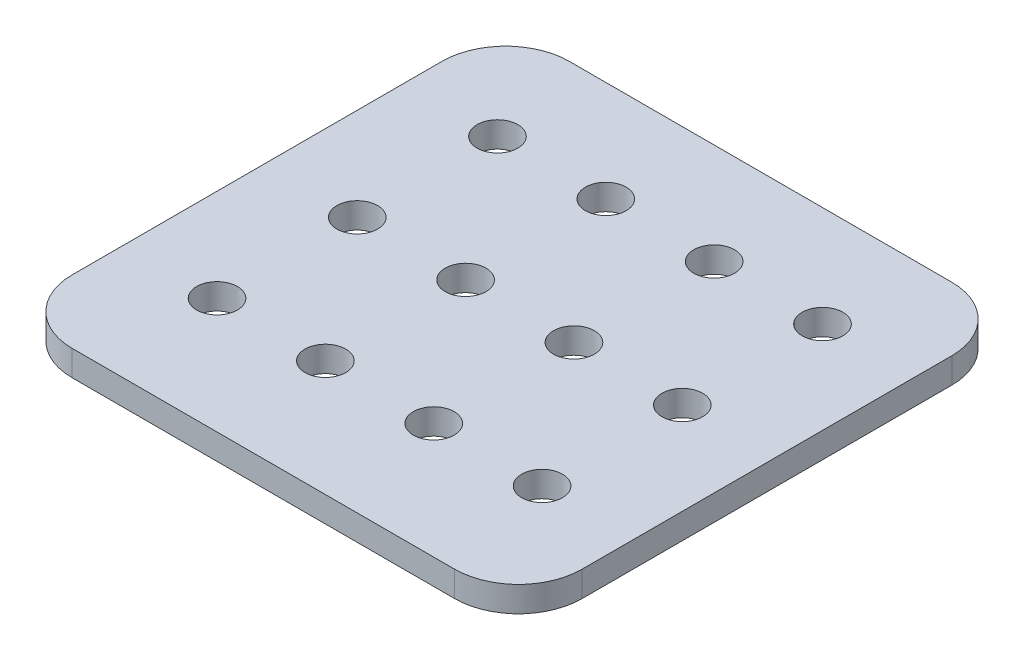
ISO-10303-21;
HEADER;
FILE_DESCRIPTION(('STEP AP214'),'2;1');
FILE_NAME('part.step','',(''),(''),'','','');
FILE_SCHEMA(('AUTOMOTIVE_DESIGN { 1 0 10303 214 1 1 1 1 }'));
ENDSEC;
DATA;
#1=APPLICATION_CONTEXT('core data for automotive mechanical design processes');
#2=APPLICATION_PROTOCOL_DEFINITION('international standard','automotive_design',2000,#1);
#3=PRODUCT_CONTEXT('',#1,'mechanical');
#4=PRODUCT('Part','Part','',(#3));
#5=PRODUCT_RELATED_PRODUCT_CATEGORY('part','',(#4));
#6=PRODUCT_DEFINITION_FORMATION('','',#4);
#7=PRODUCT_DEFINITION_CONTEXT('part definition',#1,'design');
#8=PRODUCT_DEFINITION('design','',#6,#7);
#9=PRODUCT_DEFINITION_SHAPE('','',#8);
#10=(LENGTH_UNIT() NAMED_UNIT(*) SI_UNIT(.MILLI.,.METRE.));
#11=(NAMED_UNIT(*) PLANE_ANGLE_UNIT() SI_UNIT($,.RADIAN.));
#12=(NAMED_UNIT(*) SI_UNIT($,.STERADIAN.) SOLID_ANGLE_UNIT());
#13=UNCERTAINTY_MEASURE_WITH_UNIT(LENGTH_MEASURE(1.E-05),#10,'distance_accuracy_value','');
#14=(GEOMETRIC_REPRESENTATION_CONTEXT(3) GLOBAL_UNCERTAINTY_ASSIGNED_CONTEXT((#13)) GLOBAL_UNIT_ASSIGNED_CONTEXT((#10,
#11,#12)) REPRESENTATION_CONTEXT('',''));
#15=CARTESIAN_POINT('',(0.,0.,0.));
#16=DIRECTION('',(0.,0.,1.));
#17=DIRECTION('',(1.,0.,0.));
#18=AXIS2_PLACEMENT_3D('',#15,#16,#17);
#19=CARTESIAN_POINT('',(0.,2.,0.));
#20=DIRECTION('',(0.,-1.,0.));
#21=DIRECTION('',(0.,0.,-1.));
#22=AXIS2_PLACEMENT_3D('',#19,#20,#21);
#23=PLANE('',#22);
#24=DIRECTION('',(0.,0.,-1.));
#25=VECTOR('',#24,1.);
#26=CARTESIAN_POINT('',(-7.22031787389912,2.,-25.1598945072976));
#27=LINE('',#26,#25);
#28=CARTESIAN_POINT('',(-7.22031787389912,2.,8.84010549270235));
#29=VERTEX_POINT('',#28);
#30=CARTESIAN_POINT('',(-7.22031787389912,2.,-20.1598945072976));
#31=VERTEX_POINT('',#30);
#32=EDGE_CURVE('E206',#29,#31,#27,.T.);
#33=ORIENTED_EDGE('',*,*,#32,.T.);
#34=CARTESIAN_POINT('',(-12.2203178738991,2.,-20.1598945072976));
#35=DIRECTION('',(0.,-1.,0.));
#36=DIRECTION('',(0.,0.,-1.));
#37=AXIS2_PLACEMENT_3D('',#34,#35,#36);
#38=CIRCLE('',#37,5.);
#39=CARTESIAN_POINT('',(-12.2203178738991,2.,-25.1598945072976));
#40=VERTEX_POINT('',#39);
#41=EDGE_CURVE('E176',#31,#40,#38,.F.);
#42=ORIENTED_EDGE('',*,*,#41,.T.);
#43=DIRECTION('',(-1.,0.,0.));
#44=VECTOR('',#43,1.);
#45=CARTESIAN_POINT('',(-47.2203178738991,2.,-25.1598945072976));
#46=LINE('',#45,#44);
#47=CARTESIAN_POINT('',(-42.2203178738991,2.,-25.1598945072976));
#48=VERTEX_POINT('',#47);
#49=EDGE_CURVE('E134',#40,#48,#46,.T.);
#50=ORIENTED_EDGE('',*,*,#49,.T.);
#51=CARTESIAN_POINT('',(-42.2203178738991,2.,-20.1598945072976));
#52=DIRECTION('',(0.,-1.,0.));
#53=DIRECTION('',(0.,0.,-1.));
#54=AXIS2_PLACEMENT_3D('',#51,#52,#53);
#55=CIRCLE('',#54,5.);
#56=CARTESIAN_POINT('',(-47.2203178738991,2.,-20.1598945072976));
#57=VERTEX_POINT('',#56);
#58=EDGE_CURVE('E170',#48,#57,#55,.F.);
#59=ORIENTED_EDGE('',*,*,#58,.T.);
#60=DIRECTION('',(0.,0.,1.));
#61=VECTOR('',#60,1.);
#62=CARTESIAN_POINT('',(-47.2203178738991,2.,13.8401054927024));
#63=LINE('',#62,#61);
#64=CARTESIAN_POINT('',(-47.2203178738991,2.,8.84010549270236));
#65=VERTEX_POINT('',#64);
#66=EDGE_CURVE('E144',#57,#65,#63,.T.);
#67=ORIENTED_EDGE('',*,*,#66,.T.);
#68=CARTESIAN_POINT('',(-42.2203178738991,2.,8.84010549270236));
#69=DIRECTION('',(0.,-1.,0.));
#70=DIRECTION('',(0.,0.,-1.));
#71=AXIS2_PLACEMENT_3D('',#68,#69,#70);
#72=CIRCLE('',#71,5.);
#73=CARTESIAN_POINT('',(-42.2203178738991,2.,13.8401054927024));
#74=VERTEX_POINT('',#73);
#75=EDGE_CURVE('E68',#65,#74,#72,.F.);
#76=ORIENTED_EDGE('',*,*,#75,.T.);
#77=DIRECTION('',(1.,0.,0.));
#78=VECTOR('',#77,1.);
#79=CARTESIAN_POINT('',(-7.22031787389912,2.,13.8401054927024));
#80=LINE('',#79,#78);
#81=CARTESIAN_POINT('',(-12.2203178738991,2.,13.8401054927024));
#82=VERTEX_POINT('',#81);
#83=EDGE_CURVE('E149',#74,#82,#80,.T.);
#84=ORIENTED_EDGE('',*,*,#83,.T.);
#85=CARTESIAN_POINT('',(-12.2203178738991,2.,8.84010549270235));
#86=DIRECTION('',(0.,-1.,0.));
#87=DIRECTION('',(0.,0.,-1.));
#88=AXIS2_PLACEMENT_3D('',#85,#86,#87);
#89=CIRCLE('',#88,5.);
#90=EDGE_CURVE('E173',#82,#29,#89,.F.);
#91=ORIENTED_EDGE('',*,*,#90,.T.);
#92=EDGE_LOOP('',(#33,#42,#50,#59,#67,#76,#84,#91));
#93=FACE_BOUND('',#92,.T.);
#94=CARTESIAN_POINT('',(-14.445697189582,2.,-17.2452207331818));
#95=DIRECTION('',(0.,1.,0.));
#96=DIRECTION('',(0.,0.,1.));
#97=AXIS2_PLACEMENT_3D('',#94,#95,#96);
#98=CIRCLE('',#97,1.6);
#99=CARTESIAN_POINT('',(-14.445697189582,2.,-15.6452207331818));
#100=VERTEX_POINT('',#99);
#101=EDGE_CURVE('E201',#100,#100,#98,.T.);
#102=ORIENTED_EDGE('',*,*,#101,.F.);
#103=EDGE_LOOP('',(#102));
#104=FACE_BOUND('',#103,.T.);
#105=CARTESIAN_POINT('',(-14.445697189582,2.,-6.24522073318179));
#106=DIRECTION('',(0.,1.,0.));
#107=DIRECTION('',(0.,0.,1.));
#108=AXIS2_PLACEMENT_3D('',#105,#106,#107);
#109=CIRCLE('',#108,1.6);
#110=CARTESIAN_POINT('',(-14.445697189582,2.,-4.64522073318179));
#111=VERTEX_POINT('',#110);
#112=EDGE_CURVE('E215',#111,#111,#109,.T.);
#113=ORIENTED_EDGE('',*,*,#112,.F.);
#114=EDGE_LOOP('',(#113));
#115=FACE_BOUND('',#114,.T.);
#116=CARTESIAN_POINT('',(-14.445697189582,2.,4.75477926681821));
#117=DIRECTION('',(0.,1.,0.));
#118=DIRECTION('',(0.,0.,1.));
#119=AXIS2_PLACEMENT_3D('',#116,#117,#118);
#120=CIRCLE('',#119,1.6);
#121=CARTESIAN_POINT('',(-14.445697189582,2.,6.35477926681821));
#122=VERTEX_POINT('',#121);
#123=EDGE_CURVE('E223',#122,#122,#120,.T.);
#124=ORIENTED_EDGE('',*,*,#123,.F.);
#125=EDGE_LOOP('',(#124));
#126=FACE_BOUND('',#125,.T.);
#127=CARTESIAN_POINT('',(-22.945697189582,2.,-17.2452207331818));
#128=DIRECTION('',(0.,1.,0.));
#129=DIRECTION('',(0.,0.,1.));
#130=AXIS2_PLACEMENT_3D('',#127,#128,#129);
#131=CIRCLE('',#130,1.6);
#132=CARTESIAN_POINT('',(-22.945697189582,2.,-15.6452207331818));
#133=VERTEX_POINT('',#132);
#134=EDGE_CURVE('E231',#133,#133,#131,.T.);
#135=ORIENTED_EDGE('',*,*,#134,.F.);
#136=EDGE_LOOP('',(#135));
#137=FACE_BOUND('',#136,.T.);
#138=CARTESIAN_POINT('',(-22.945697189582,2.,-6.24522073318179));
#139=DIRECTION('',(0.,1.,0.));
#140=DIRECTION('',(0.,0.,1.));
#141=AXIS2_PLACEMENT_3D('',#138,#139,#140);
#142=CIRCLE('',#141,1.6);
#143=CARTESIAN_POINT('',(-22.945697189582,2.,-4.64522073318179));
#144=VERTEX_POINT('',#143);
#145=EDGE_CURVE('E239',#144,#144,#142,.T.);
#146=ORIENTED_EDGE('',*,*,#145,.F.);
#147=EDGE_LOOP('',(#146));
#148=FACE_BOUND('',#147,.T.);
#149=CARTESIAN_POINT('',(-22.945697189582,2.,4.75477926681821));
#150=DIRECTION('',(0.,1.,0.));
#151=DIRECTION('',(0.,0.,1.));
#152=AXIS2_PLACEMENT_3D('',#149,#150,#151);
#153=CIRCLE('',#152,1.6);
#154=CARTESIAN_POINT('',(-22.945697189582,2.,6.35477926681821));
#155=VERTEX_POINT('',#154);
#156=EDGE_CURVE('E247',#155,#155,#153,.T.);
#157=ORIENTED_EDGE('',*,*,#156,.F.);
#158=EDGE_LOOP('',(#157));
#159=FACE_BOUND('',#158,.T.);
#160=CARTESIAN_POINT('',(-31.445697189582,2.,-17.2452207331818));
#161=DIRECTION('',(0.,1.,0.));
#162=DIRECTION('',(0.,0.,1.));
#163=AXIS2_PLACEMENT_3D('',#160,#161,#162);
#164=CIRCLE('',#163,1.6);
#165=CARTESIAN_POINT('',(-31.445697189582,2.,-15.6452207331818));
#166=VERTEX_POINT('',#165);
#167=EDGE_CURVE('E255',#166,#166,#164,.T.);
#168=ORIENTED_EDGE('',*,*,#167,.F.);
#169=EDGE_LOOP('',(#168));
#170=FACE_BOUND('',#169,.T.);
#171=CARTESIAN_POINT('',(-31.445697189582,2.,-6.24522073318179));
#172=DIRECTION('',(0.,1.,0.));
#173=DIRECTION('',(0.,0.,1.));
#174=AXIS2_PLACEMENT_3D('',#171,#172,#173);
#175=CIRCLE('',#174,1.6);
#176=CARTESIAN_POINT('',(-31.445697189582,2.,-4.64522073318179));
#177=VERTEX_POINT('',#176);
#178=EDGE_CURVE('E263',#177,#177,#175,.T.);
#179=ORIENTED_EDGE('',*,*,#178,.F.);
#180=EDGE_LOOP('',(#179));
#181=FACE_BOUND('',#180,.T.);
#182=CARTESIAN_POINT('',(-31.445697189582,2.,4.75477926681821));
#183=DIRECTION('',(0.,1.,0.));
#184=DIRECTION('',(0.,0.,1.));
#185=AXIS2_PLACEMENT_3D('',#182,#183,#184);
#186=CIRCLE('',#185,1.6);
#187=CARTESIAN_POINT('',(-31.445697189582,2.,6.35477926681821));
#188=VERTEX_POINT('',#187);
#189=EDGE_CURVE('E271',#188,#188,#186,.T.);
#190=ORIENTED_EDGE('',*,*,#189,.F.);
#191=EDGE_LOOP('',(#190));
#192=FACE_BOUND('',#191,.T.);
#193=CARTESIAN_POINT('',(-39.945697189582,2.,-17.2452207331818));
#194=DIRECTION('',(0.,1.,0.));
#195=DIRECTION('',(0.,0.,1.));
#196=AXIS2_PLACEMENT_3D('',#193,#194,#195);
#197=CIRCLE('',#196,1.6);
#198=CARTESIAN_POINT('',(-39.945697189582,2.,-15.6452207331818));
#199=VERTEX_POINT('',#198);
#200=EDGE_CURVE('E279',#199,#199,#197,.T.);
#201=ORIENTED_EDGE('',*,*,#200,.F.);
#202=EDGE_LOOP('',(#201));
#203=FACE_BOUND('',#202,.T.);
#204=CARTESIAN_POINT('',(-39.945697189582,2.,-6.24522073318179));
#205=DIRECTION('',(0.,1.,0.));
#206=DIRECTION('',(0.,0.,1.));
#207=AXIS2_PLACEMENT_3D('',#204,#205,#206);
#208=CIRCLE('',#207,1.60000000000001);
#209=CARTESIAN_POINT('',(-39.945697189582,2.,-4.64522073318179));
#210=VERTEX_POINT('',#209);
#211=EDGE_CURVE('E287',#210,#210,#208,.T.);
#212=ORIENTED_EDGE('',*,*,#211,.F.);
#213=EDGE_LOOP('',(#212));
#214=FACE_BOUND('',#213,.T.);
#215=CARTESIAN_POINT('',(-39.945697189582,2.,4.75477926681821));
#216=DIRECTION('',(0.,1.,0.));
#217=DIRECTION('',(0.,0.,1.));
#218=AXIS2_PLACEMENT_3D('',#215,#216,#217);
#219=CIRCLE('',#218,1.60000000000001);
#220=CARTESIAN_POINT('',(-39.945697189582,2.,6.35477926681821));
#221=VERTEX_POINT('',#220);
#222=EDGE_CURVE('E295',#221,#221,#219,.T.);
#223=ORIENTED_EDGE('',*,*,#222,.F.);
#224=EDGE_LOOP('',(#223));
#225=FACE_BOUND('',#224,.T.);
#226=ADVANCED_FACE('F45',(#93,#104,#115,#126,#137,#148,#159,#170,#181,#192,#203,#214,#225),#23,.F.);
#227=CARTESIAN_POINT('',(0.,0.,0.));
#228=DIRECTION('',(0.,-1.,0.));
#229=DIRECTION('',(0.,0.,-1.));
#230=AXIS2_PLACEMENT_3D('',#227,#228,#229);
#231=PLANE('',#230);
#232=CARTESIAN_POINT('',(-39.945697189582,0.,-6.24522073318179));
#233=DIRECTION('',(0.,1.,0.));
#234=DIRECTION('',(0.,0.,1.));
#235=AXIS2_PLACEMENT_3D('',#232,#233,#234);
#236=CIRCLE('',#235,1.60000000000001);
#237=CARTESIAN_POINT('',(-39.945697189582,0.,-4.64522073318179));
#238=VERTEX_POINT('',#237);
#239=EDGE_CURVE('E291',#238,#238,#236,.T.);
#240=ORIENTED_EDGE('',*,*,#239,.T.);
#241=EDGE_LOOP('',(#240));
#242=FACE_BOUND('',#241,.T.);
#243=CARTESIAN_POINT('',(-31.445697189582,0.,4.75477926681821));
#244=DIRECTION('',(0.,1.,0.));
#245=DIRECTION('',(0.,0.,1.));
#246=AXIS2_PLACEMENT_3D('',#243,#244,#245);
#247=CIRCLE('',#246,1.6);
#248=CARTESIAN_POINT('',(-31.445697189582,0.,6.35477926681821));
#249=VERTEX_POINT('',#248);
#250=EDGE_CURVE('E275',#249,#249,#247,.T.);
#251=ORIENTED_EDGE('',*,*,#250,.T.);
#252=EDGE_LOOP('',(#251));
#253=FACE_BOUND('',#252,.T.);
#254=CARTESIAN_POINT('',(-31.445697189582,0.,-17.2452207331818));
#255=DIRECTION('',(0.,1.,0.));
#256=DIRECTION('',(0.,0.,1.));
#257=AXIS2_PLACEMENT_3D('',#254,#255,#256);
#258=CIRCLE('',#257,1.6);
#259=CARTESIAN_POINT('',(-31.445697189582,0.,-15.6452207331818));
#260=VERTEX_POINT('',#259);
#261=EDGE_CURVE('E259',#260,#260,#258,.T.);
#262=ORIENTED_EDGE('',*,*,#261,.T.);
#263=EDGE_LOOP('',(#262));
#264=FACE_BOUND('',#263,.T.);
#265=CARTESIAN_POINT('',(-22.945697189582,0.,-6.24522073318179));
#266=DIRECTION('',(0.,1.,0.));
#267=DIRECTION('',(0.,0.,1.));
#268=AXIS2_PLACEMENT_3D('',#265,#266,#267);
#269=CIRCLE('',#268,1.6);
#270=CARTESIAN_POINT('',(-22.945697189582,0.,-4.64522073318179));
#271=VERTEX_POINT('',#270);
#272=EDGE_CURVE('E243',#271,#271,#269,.T.);
#273=ORIENTED_EDGE('',*,*,#272,.T.);
#274=EDGE_LOOP('',(#273));
#275=FACE_BOUND('',#274,.T.);
#276=CARTESIAN_POINT('',(-14.445697189582,0.,4.75477926681821));
#277=DIRECTION('',(0.,1.,0.));
#278=DIRECTION('',(0.,0.,1.));
#279=AXIS2_PLACEMENT_3D('',#276,#277,#278);
#280=CIRCLE('',#279,1.6);
#281=CARTESIAN_POINT('',(-14.445697189582,0.,6.35477926681821));
#282=VERTEX_POINT('',#281);
#283=EDGE_CURVE('E227',#282,#282,#280,.T.);
#284=ORIENTED_EDGE('',*,*,#283,.T.);
#285=EDGE_LOOP('',(#284));
#286=FACE_BOUND('',#285,.T.);
#287=CARTESIAN_POINT('',(-14.445697189582,0.,-17.2452207331818));
#288=DIRECTION('',(0.,1.,0.));
#289=DIRECTION('',(0.,0.,1.));
#290=AXIS2_PLACEMENT_3D('',#287,#288,#289);
#291=CIRCLE('',#290,1.6);
#292=CARTESIAN_POINT('',(-14.445697189582,0.,-15.6452207331818));
#293=VERTEX_POINT('',#292);
#294=EDGE_CURVE('E211',#293,#293,#291,.T.);
#295=ORIENTED_EDGE('',*,*,#294,.T.);
#296=EDGE_LOOP('',(#295));
#297=FACE_BOUND('',#296,.T.);
#298=DIRECTION('',(-1.,0.,0.));
#299=VECTOR('',#298,1.);
#300=CARTESIAN_POINT('',(-47.2203178738991,0.,-25.1598945072976));
#301=LINE('',#300,#299);
#302=CARTESIAN_POINT('',(-12.2203178738991,0.,-25.1598945072976));
#303=VERTEX_POINT('',#302);
#304=CARTESIAN_POINT('',(-42.2203178738991,0.,-25.1598945072976));
#305=VERTEX_POINT('',#304);
#306=EDGE_CURVE('E131',#303,#305,#301,.T.);
#307=ORIENTED_EDGE('',*,*,#306,.F.);
#308=CARTESIAN_POINT('',(-12.2203178738991,0.,-20.1598945072976));
#309=DIRECTION('',(0.,-1.,0.));
#310=DIRECTION('',(0.,0.,-1.));
#311=AXIS2_PLACEMENT_3D('',#308,#309,#310);
#312=CIRCLE('',#311,5.);
#313=CARTESIAN_POINT('',(-7.22031787389912,0.,-20.1598945072976));
#314=VERTEX_POINT('',#313);
#315=EDGE_CURVE('E113',#303,#314,#312,.T.);
#316=ORIENTED_EDGE('',*,*,#315,.T.);
#317=DIRECTION('',(0.,0.,-1.));
#318=VECTOR('',#317,1.);
#319=CARTESIAN_POINT('',(-7.22031787389912,0.,-25.1598945072976));
#320=LINE('',#319,#318);
#321=CARTESIAN_POINT('',(-7.22031787389912,0.,8.84010549270235));
#322=VERTEX_POINT('',#321);
#323=EDGE_CURVE('E145',#322,#314,#320,.T.);
#324=ORIENTED_EDGE('',*,*,#323,.F.);
#325=CARTESIAN_POINT('',(-12.2203178738991,0.,8.84010549270235));
#326=DIRECTION('',(0.,-1.,0.));
#327=DIRECTION('',(0.,0.,-1.));
#328=AXIS2_PLACEMENT_3D('',#325,#326,#327);
#329=CIRCLE('',#328,5.);
#330=CARTESIAN_POINT('',(-12.2203178738991,0.,13.8401054927024));
#331=VERTEX_POINT('',#330);
#332=EDGE_CURVE('E125',#322,#331,#329,.T.);
#333=ORIENTED_EDGE('',*,*,#332,.T.);
#334=DIRECTION('',(1.,0.,0.));
#335=VECTOR('',#334,1.);
#336=CARTESIAN_POINT('',(-7.22031787389912,0.,13.8401054927024));
#337=LINE('',#336,#335);
#338=CARTESIAN_POINT('',(-42.2203178738991,0.,13.8401054927024));
#339=VERTEX_POINT('',#338);
#340=EDGE_CURVE('E151',#339,#331,#337,.T.);
#341=ORIENTED_EDGE('',*,*,#340,.F.);
#342=CARTESIAN_POINT('',(-42.2203178738991,0.,8.84010549270236));
#343=DIRECTION('',(0.,-1.,0.));
#344=DIRECTION('',(0.,0.,-1.));
#345=AXIS2_PLACEMENT_3D('',#342,#343,#344);
#346=CIRCLE('',#345,5.);
#347=CARTESIAN_POINT('',(-47.2203178738991,0.,8.84010549270236));
#348=VERTEX_POINT('',#347);
#349=EDGE_CURVE('E136',#339,#348,#346,.T.);
#350=ORIENTED_EDGE('',*,*,#349,.T.);
#351=DIRECTION('',(0.,0.,1.));
#352=VECTOR('',#351,1.);
#353=CARTESIAN_POINT('',(-47.2203178738991,0.,13.8401054927024));
#354=LINE('',#353,#352);
#355=CARTESIAN_POINT('',(-47.2203178738991,0.,-20.1598945072976));
#356=VERTEX_POINT('',#355);
#357=EDGE_CURVE('E191',#356,#348,#354,.T.);
#358=ORIENTED_EDGE('',*,*,#357,.F.);
#359=CARTESIAN_POINT('',(-42.2203178738991,0.,-20.1598945072976));
#360=DIRECTION('',(0.,-1.,0.));
#361=DIRECTION('',(0.,0.,-1.));
#362=AXIS2_PLACEMENT_3D('',#359,#360,#361);
#363=CIRCLE('',#362,5.);
#364=EDGE_CURVE('E142',#356,#305,#363,.T.);
#365=ORIENTED_EDGE('',*,*,#364,.T.);
#366=EDGE_LOOP('',(#307,#316,#324,#333,#341,#350,#358,#365));
#367=FACE_BOUND('',#366,.T.);
#368=CARTESIAN_POINT('',(-14.445697189582,0.,-6.24522073318179));
#369=DIRECTION('',(0.,1.,0.));
#370=DIRECTION('',(0.,0.,1.));
#371=AXIS2_PLACEMENT_3D('',#368,#369,#370);
#372=CIRCLE('',#371,1.6);
#373=CARTESIAN_POINT('',(-14.445697189582,0.,-4.64522073318179));
#374=VERTEX_POINT('',#373);
#375=EDGE_CURVE('E219',#374,#374,#372,.T.);
#376=ORIENTED_EDGE('',*,*,#375,.T.);
#377=EDGE_LOOP('',(#376));
#378=FACE_BOUND('',#377,.T.);
#379=CARTESIAN_POINT('',(-22.945697189582,0.,-17.2452207331818));
#380=DIRECTION('',(0.,1.,0.));
#381=DIRECTION('',(0.,0.,1.));
#382=AXIS2_PLACEMENT_3D('',#379,#380,#381);
#383=CIRCLE('',#382,1.6);
#384=CARTESIAN_POINT('',(-22.945697189582,0.,-15.6452207331818));
#385=VERTEX_POINT('',#384);
#386=EDGE_CURVE('E235',#385,#385,#383,.T.);
#387=ORIENTED_EDGE('',*,*,#386,.T.);
#388=EDGE_LOOP('',(#387));
#389=FACE_BOUND('',#388,.T.);
#390=CARTESIAN_POINT('',(-22.945697189582,0.,4.75477926681821));
#391=DIRECTION('',(0.,1.,0.));
#392=DIRECTION('',(0.,0.,1.));
#393=AXIS2_PLACEMENT_3D('',#390,#391,#392);
#394=CIRCLE('',#393,1.6);
#395=CARTESIAN_POINT('',(-22.945697189582,0.,6.35477926681821));
#396=VERTEX_POINT('',#395);
#397=EDGE_CURVE('E251',#396,#396,#394,.T.);
#398=ORIENTED_EDGE('',*,*,#397,.T.);
#399=EDGE_LOOP('',(#398));
#400=FACE_BOUND('',#399,.T.);
#401=CARTESIAN_POINT('',(-31.445697189582,0.,-6.24522073318179));
#402=DIRECTION('',(0.,1.,0.));
#403=DIRECTION('',(0.,0.,1.));
#404=AXIS2_PLACEMENT_3D('',#401,#402,#403);
#405=CIRCLE('',#404,1.6);
#406=CARTESIAN_POINT('',(-31.445697189582,0.,-4.64522073318179));
#407=VERTEX_POINT('',#406);
#408=EDGE_CURVE('E267',#407,#407,#405,.T.);
#409=ORIENTED_EDGE('',*,*,#408,.T.);
#410=EDGE_LOOP('',(#409));
#411=FACE_BOUND('',#410,.T.);
#412=CARTESIAN_POINT('',(-39.945697189582,0.,-17.2452207331818));
#413=DIRECTION('',(0.,1.,0.));
#414=DIRECTION('',(0.,0.,1.));
#415=AXIS2_PLACEMENT_3D('',#412,#413,#414);
#416=CIRCLE('',#415,1.6);
#417=CARTESIAN_POINT('',(-39.945697189582,0.,-15.6452207331818));
#418=VERTEX_POINT('',#417);
#419=EDGE_CURVE('E283',#418,#418,#416,.T.);
#420=ORIENTED_EDGE('',*,*,#419,.T.);
#421=EDGE_LOOP('',(#420));
#422=FACE_BOUND('',#421,.T.);
#423=CARTESIAN_POINT('',(-39.945697189582,0.,4.75477926681821));
#424=DIRECTION('',(0.,1.,0.));
#425=DIRECTION('',(0.,0.,1.));
#426=AXIS2_PLACEMENT_3D('',#423,#424,#425);
#427=CIRCLE('',#426,1.60000000000001);
#428=CARTESIAN_POINT('',(-39.945697189582,0.,6.35477926681821));
#429=VERTEX_POINT('',#428);
#430=EDGE_CURVE('E299',#429,#429,#427,.T.);
#431=ORIENTED_EDGE('',*,*,#430,.T.);
#432=EDGE_LOOP('',(#431));
#433=FACE_BOUND('',#432,.T.);
#434=ADVANCED_FACE('F139',(#242,#253,#264,#275,#286,#297,#367,#378,#389,#400,#411,#422,#433),
#231,.T.);
#435=CARTESIAN_POINT('',(-47.2203178738991,2.,13.8401054927024));
#436=DIRECTION('',(1.,0.,0.));
#437=DIRECTION('',(0.,0.,-1.));
#438=AXIS2_PLACEMENT_3D('',#435,#436,#437);
#439=PLANE('',#438);
#440=ORIENTED_EDGE('',*,*,#66,.F.);
#441=DIRECTION('',(0.,-1.,0.));
#442=VECTOR('',#441,1.);
#443=CARTESIAN_POINT('',(-47.2203178738991,2.,-20.1598945072976));
#444=LINE('',#443,#442);
#445=EDGE_CURVE('E11',#57,#356,#444,.T.);
#446=ORIENTED_EDGE('',*,*,#445,.T.);
#447=ORIENTED_EDGE('',*,*,#357,.T.);
#448=DIRECTION('',(0.,-1.,0.));
#449=VECTOR('',#448,1.);
#450=CARTESIAN_POINT('',(-47.2203178738991,2.,8.84010549270236));
#451=LINE('',#450,#449);
#452=EDGE_CURVE('E54',#348,#65,#451,.F.);
#453=ORIENTED_EDGE('',*,*,#452,.T.);
#454=EDGE_LOOP('',(#440,#446,#447,#453));
#455=FACE_BOUND('',#454,.T.);
#456=ADVANCED_FACE('F189',(#455),#439,.F.);
#457=CARTESIAN_POINT('',(-7.22031787389912,2.,13.8401054927024));
#458=DIRECTION('',(0.,0.,-1.));
#459=DIRECTION('',(-1.,0.,0.));
#460=AXIS2_PLACEMENT_3D('',#457,#458,#459);
#461=PLANE('',#460);
#462=ORIENTED_EDGE('',*,*,#340,.T.);
#463=DIRECTION('',(0.,-1.,0.));
#464=VECTOR('',#463,1.);
#465=CARTESIAN_POINT('',(-12.2203178738991,2.,13.8401054927024));
#466=LINE('',#465,#464);
#467=EDGE_CURVE('E61',#331,#82,#466,.F.);
#468=ORIENTED_EDGE('',*,*,#467,.T.);
#469=ORIENTED_EDGE('',*,*,#83,.F.);
#470=DIRECTION('',(0.,-1.,0.));
#471=VECTOR('',#470,1.);
#472=CARTESIAN_POINT('',(-42.2203178738991,2.,13.8401054927024));
#473=LINE('',#472,#471);
#474=EDGE_CURVE('E179',#74,#339,#473,.T.);
#475=ORIENTED_EDGE('',*,*,#474,.T.);
#476=EDGE_LOOP('',(#462,#468,#469,#475));
#477=FACE_BOUND('',#476,.T.);
#478=ADVANCED_FACE('F198',(#477),#461,.F.);
#479=CARTESIAN_POINT('',(-7.22031787389912,2.,-25.1598945072976));
#480=DIRECTION('',(-1.,0.,0.));
#481=DIRECTION('',(0.,0.,1.));
#482=AXIS2_PLACEMENT_3D('',#479,#480,#481);
#483=PLANE('',#482);
#484=ORIENTED_EDGE('',*,*,#323,.T.);
#485=DIRECTION('',(0.,-1.,0.));
#486=VECTOR('',#485,1.);
#487=CARTESIAN_POINT('',(-7.22031787389912,2.,-20.1598945072976));
#488=LINE('',#487,#486);
#489=EDGE_CURVE('E118',#314,#31,#488,.F.);
#490=ORIENTED_EDGE('',*,*,#489,.T.);
#491=ORIENTED_EDGE('',*,*,#32,.F.);
#492=DIRECTION('',(0.,-1.,0.));
#493=VECTOR('',#492,1.);
#494=CARTESIAN_POINT('',(-7.22031787389912,2.,8.84010549270235));
#495=LINE('',#494,#493);
#496=EDGE_CURVE('E124',#29,#322,#495,.T.);
#497=ORIENTED_EDGE('',*,*,#496,.T.);
#498=EDGE_LOOP('',(#484,#490,#491,#497));
#499=FACE_BOUND('',#498,.T.);
#500=ADVANCED_FACE('F323',(#499),#483,.F.);
#501=CARTESIAN_POINT('',(-47.2203178738991,2.,-25.1598945072976));
#502=DIRECTION('',(0.,0.,1.));
#503=DIRECTION('',(1.,0.,0.));
#504=AXIS2_PLACEMENT_3D('',#501,#502,#503);
#505=PLANE('',#504);
#506=ORIENTED_EDGE('',*,*,#49,.F.);
#507=DIRECTION('',(0.,-1.,0.));
#508=VECTOR('',#507,1.);
#509=CARTESIAN_POINT('',(-12.2203178738991,2.,-25.1598945072976));
#510=LINE('',#509,#508);
#511=EDGE_CURVE('E117',#40,#303,#510,.T.);
#512=ORIENTED_EDGE('',*,*,#511,.T.);
#513=ORIENTED_EDGE('',*,*,#306,.T.);
#514=DIRECTION('',(0.,-1.,0.));
#515=VECTOR('',#514,1.);
#516=CARTESIAN_POINT('',(-42.2203178738991,2.,-25.1598945072976));
#517=LINE('',#516,#515);
#518=EDGE_CURVE('E137',#305,#48,#517,.F.);
#519=ORIENTED_EDGE('',*,*,#518,.T.);
#520=EDGE_LOOP('',(#506,#512,#513,#519));
#521=FACE_BOUND('',#520,.T.);
#522=ADVANCED_FACE('F130',(#521),#505,.F.);
#523=CARTESIAN_POINT('',(-14.445697189582,2.,-17.2452207331818));
#524=DIRECTION('',(0.,-1.,0.));
#525=DIRECTION('',(0.,0.,-1.));
#526=AXIS2_PLACEMENT_3D('',#523,#524,#525);
#527=CYLINDRICAL_SURFACE('',#526,1.6);
#528=ORIENTED_EDGE('',*,*,#101,.T.);
#529=EDGE_LOOP('',(#528));
#530=FACE_BOUND('',#529,.T.);
#531=ORIENTED_EDGE('',*,*,#294,.F.);
#532=EDGE_LOOP('',(#531));
#533=FACE_BOUND('',#532,.T.);
#534=ADVANCED_FACE('F318',(#530,#533),#527,.F.);
#535=CARTESIAN_POINT('',(-14.445697189582,2.,-6.24522073318179));
#536=DIRECTION('',(0.,-1.,0.));
#537=DIRECTION('',(0.,0.,-1.));
#538=AXIS2_PLACEMENT_3D('',#535,#536,#537);
#539=CYLINDRICAL_SURFACE('',#538,1.6);
#540=ORIENTED_EDGE('',*,*,#112,.T.);
#541=EDGE_LOOP('',(#540));
#542=FACE_BOUND('',#541,.T.);
#543=ORIENTED_EDGE('',*,*,#375,.F.);
#544=EDGE_LOOP('',(#543));
#545=FACE_BOUND('',#544,.T.);
#546=ADVANCED_FACE('F463',(#542,#545),#539,.F.);
#547=CARTESIAN_POINT('',(-14.445697189582,2.,4.75477926681821));
#548=DIRECTION('',(0.,-1.,0.));
#549=DIRECTION('',(0.,0.,-1.));
#550=AXIS2_PLACEMENT_3D('',#547,#548,#549);
#551=CYLINDRICAL_SURFACE('',#550,1.6);
#552=ORIENTED_EDGE('',*,*,#123,.T.);
#553=EDGE_LOOP('',(#552));
#554=FACE_BOUND('',#553,.T.);
#555=ORIENTED_EDGE('',*,*,#283,.F.);
#556=EDGE_LOOP('',(#555));
#557=FACE_BOUND('',#556,.T.);
#558=ADVANCED_FACE('F453',(#554,#557),#551,.F.);
#559=CARTESIAN_POINT('',(-22.945697189582,2.,-17.2452207331818));
#560=DIRECTION('',(0.,-1.,0.));
#561=DIRECTION('',(0.,0.,-1.));
#562=AXIS2_PLACEMENT_3D('',#559,#560,#561);
#563=CYLINDRICAL_SURFACE('',#562,1.6);
#564=ORIENTED_EDGE('',*,*,#134,.T.);
#565=EDGE_LOOP('',(#564));
#566=FACE_BOUND('',#565,.T.);
#567=ORIENTED_EDGE('',*,*,#386,.F.);
#568=EDGE_LOOP('',(#567));
#569=FACE_BOUND('',#568,.T.);
#570=ADVANCED_FACE('F443',(#566,#569),#563,.F.);
#571=CARTESIAN_POINT('',(-22.945697189582,2.,-6.24522073318179));
#572=DIRECTION('',(0.,-1.,0.));
#573=DIRECTION('',(0.,0.,-1.));
#574=AXIS2_PLACEMENT_3D('',#571,#572,#573);
#575=CYLINDRICAL_SURFACE('',#574,1.6);
#576=ORIENTED_EDGE('',*,*,#145,.T.);
#577=EDGE_LOOP('',(#576));
#578=FACE_BOUND('',#577,.T.);
#579=ORIENTED_EDGE('',*,*,#272,.F.);
#580=EDGE_LOOP('',(#579));
#581=FACE_BOUND('',#580,.T.);
#582=ADVANCED_FACE('F433',(#578,#581),#575,.F.);
#583=CARTESIAN_POINT('',(-22.945697189582,2.,4.75477926681821));
#584=DIRECTION('',(0.,-1.,0.));
#585=DIRECTION('',(0.,0.,-1.));
#586=AXIS2_PLACEMENT_3D('',#583,#584,#585);
#587=CYLINDRICAL_SURFACE('',#586,1.6);
#588=ORIENTED_EDGE('',*,*,#156,.T.);
#589=EDGE_LOOP('',(#588));
#590=FACE_BOUND('',#589,.T.);
#591=ORIENTED_EDGE('',*,*,#397,.F.);
#592=EDGE_LOOP('',(#591));
#593=FACE_BOUND('',#592,.T.);
#594=ADVANCED_FACE('F423',(#590,#593),#587,.F.);
#595=CARTESIAN_POINT('',(-31.445697189582,2.,-17.2452207331818));
#596=DIRECTION('',(0.,-1.,0.));
#597=DIRECTION('',(0.,0.,-1.));
#598=AXIS2_PLACEMENT_3D('',#595,#596,#597);
#599=CYLINDRICAL_SURFACE('',#598,1.6);
#600=ORIENTED_EDGE('',*,*,#167,.T.);
#601=EDGE_LOOP('',(#600));
#602=FACE_BOUND('',#601,.T.);
#603=ORIENTED_EDGE('',*,*,#261,.F.);
#604=EDGE_LOOP('',(#603));
#605=FACE_BOUND('',#604,.T.);
#606=ADVANCED_FACE('F413',(#602,#605),#599,.F.);
#607=CARTESIAN_POINT('',(-31.445697189582,2.,-6.24522073318179));
#608=DIRECTION('',(0.,-1.,0.));
#609=DIRECTION('',(0.,0.,-1.));
#610=AXIS2_PLACEMENT_3D('',#607,#608,#609);
#611=CYLINDRICAL_SURFACE('',#610,1.6);
#612=ORIENTED_EDGE('',*,*,#178,.T.);
#613=EDGE_LOOP('',(#612));
#614=FACE_BOUND('',#613,.T.);
#615=ORIENTED_EDGE('',*,*,#408,.F.);
#616=EDGE_LOOP('',(#615));
#617=FACE_BOUND('',#616,.T.);
#618=ADVANCED_FACE('F403',(#614,#617),#611,.F.);
#619=CARTESIAN_POINT('',(-31.445697189582,2.,4.75477926681821));
#620=DIRECTION('',(0.,-1.,0.));
#621=DIRECTION('',(0.,0.,-1.));
#622=AXIS2_PLACEMENT_3D('',#619,#620,#621);
#623=CYLINDRICAL_SURFACE('',#622,1.6);
#624=ORIENTED_EDGE('',*,*,#189,.T.);
#625=EDGE_LOOP('',(#624));
#626=FACE_BOUND('',#625,.T.);
#627=ORIENTED_EDGE('',*,*,#250,.F.);
#628=EDGE_LOOP('',(#627));
#629=FACE_BOUND('',#628,.T.);
#630=ADVANCED_FACE('F393',(#626,#629),#623,.F.);
#631=CARTESIAN_POINT('',(-39.945697189582,2.,-17.2452207331818));
#632=DIRECTION('',(0.,-1.,0.));
#633=DIRECTION('',(0.,0.,-1.));
#634=AXIS2_PLACEMENT_3D('',#631,#632,#633);
#635=CYLINDRICAL_SURFACE('',#634,1.6);
#636=ORIENTED_EDGE('',*,*,#200,.T.);
#637=EDGE_LOOP('',(#636));
#638=FACE_BOUND('',#637,.T.);
#639=ORIENTED_EDGE('',*,*,#419,.F.);
#640=EDGE_LOOP('',(#639));
#641=FACE_BOUND('',#640,.T.);
#642=ADVANCED_FACE('F383',(#638,#641),#635,.F.);
#643=CARTESIAN_POINT('',(-39.945697189582,2.,-6.24522073318179));
#644=DIRECTION('',(0.,-1.,0.));
#645=DIRECTION('',(0.,0.,-1.));
#646=AXIS2_PLACEMENT_3D('',#643,#644,#645);
#647=CYLINDRICAL_SURFACE('',#646,1.60000000000001);
#648=ORIENTED_EDGE('',*,*,#211,.T.);
#649=EDGE_LOOP('',(#648));
#650=FACE_BOUND('',#649,.T.);
#651=ORIENTED_EDGE('',*,*,#239,.F.);
#652=EDGE_LOOP('',(#651));
#653=FACE_BOUND('',#652,.T.);
#654=ADVANCED_FACE('F373',(#650,#653),#647,.F.);
#655=CARTESIAN_POINT('',(-39.945697189582,2.,4.75477926681821));
#656=DIRECTION('',(0.,-1.,0.));
#657=DIRECTION('',(0.,0.,-1.));
#658=AXIS2_PLACEMENT_3D('',#655,#656,#657);
#659=CYLINDRICAL_SURFACE('',#658,1.60000000000001);
#660=ORIENTED_EDGE('',*,*,#222,.T.);
#661=EDGE_LOOP('',(#660));
#662=FACE_BOUND('',#661,.T.);
#663=ORIENTED_EDGE('',*,*,#430,.F.);
#664=EDGE_LOOP('',(#663));
#665=FACE_BOUND('',#664,.T.);
#666=ADVANCED_FACE('F307',(#662,#665),#659,.F.);
#667=CARTESIAN_POINT('',(-12.2203178738991,2.,-20.1598945072976));
#668=DIRECTION('',(0.,-1.,0.));
#669=DIRECTION('',(0.,0.,-1.));
#670=AXIS2_PLACEMENT_3D('',#667,#668,#669);
#671=CYLINDRICAL_SURFACE('',#670,5.);
#672=ORIENTED_EDGE('',*,*,#41,.F.);
#673=ORIENTED_EDGE('',*,*,#489,.F.);
#674=ORIENTED_EDGE('',*,*,#315,.F.);
#675=ORIENTED_EDGE('',*,*,#511,.F.);
#676=EDGE_LOOP('',(#672,#673,#674,#675));
#677=FACE_BOUND('',#676,.T.);
#678=ADVANCED_FACE('F116',(#677),#671,.T.);
#679=CARTESIAN_POINT('',(-12.2203178738991,2.,8.84010549270235));
#680=DIRECTION('',(0.,-1.,0.));
#681=DIRECTION('',(0.,0.,-1.));
#682=AXIS2_PLACEMENT_3D('',#679,#680,#681);
#683=CYLINDRICAL_SURFACE('',#682,5.);
#684=ORIENTED_EDGE('',*,*,#90,.F.);
#685=ORIENTED_EDGE('',*,*,#467,.F.);
#686=ORIENTED_EDGE('',*,*,#332,.F.);
#687=ORIENTED_EDGE('',*,*,#496,.F.);
#688=EDGE_LOOP('',(#684,#685,#686,#687));
#689=FACE_BOUND('',#688,.T.);
#690=ADVANCED_FACE('F333',(#689),#683,.T.);
#691=CARTESIAN_POINT('',(-42.2203178738991,2.,-20.1598945072976));
#692=DIRECTION('',(0.,-1.,0.));
#693=DIRECTION('',(0.,0.,-1.));
#694=AXIS2_PLACEMENT_3D('',#691,#692,#693);
#695=CYLINDRICAL_SURFACE('',#694,5.);
#696=ORIENTED_EDGE('',*,*,#58,.F.);
#697=ORIENTED_EDGE('',*,*,#518,.F.);
#698=ORIENTED_EDGE('',*,*,#364,.F.);
#699=ORIENTED_EDGE('',*,*,#445,.F.);
#700=EDGE_LOOP('',(#696,#697,#698,#699));
#701=FACE_BOUND('',#700,.T.);
#702=ADVANCED_FACE('F335',(#701),#695,.T.);
#703=CARTESIAN_POINT('',(-42.2203178738991,2.,8.84010549270236));
#704=DIRECTION('',(0.,-1.,0.));
#705=DIRECTION('',(0.,0.,-1.));
#706=AXIS2_PLACEMENT_3D('',#703,#704,#705);
#707=CYLINDRICAL_SURFACE('',#706,5.);
#708=ORIENTED_EDGE('',*,*,#75,.F.);
#709=ORIENTED_EDGE('',*,*,#452,.F.);
#710=ORIENTED_EDGE('',*,*,#349,.F.);
#711=ORIENTED_EDGE('',*,*,#474,.F.);
#712=EDGE_LOOP('',(#708,#709,#710,#711));
#713=FACE_BOUND('',#712,.T.);
#714=ADVANCED_FACE('F47',(#713),#707,.T.);
#715=CLOSED_SHELL('',(#226,#434,#456,#478,#500,#522,#534,#546,#558,#570,#582,#594,#606,#618,
#630,#642,#654,#666,#678,#690,#702,#714));
#716=MANIFOLD_SOLID_BREP('B2',#715);
#717=ADVANCED_BREP_SHAPE_REPRESENTATION('',(#18,#716),#14);
#718=SHAPE_DEFINITION_REPRESENTATION(#9,#717);
ENDSEC;
END-ISO-10303-21;
